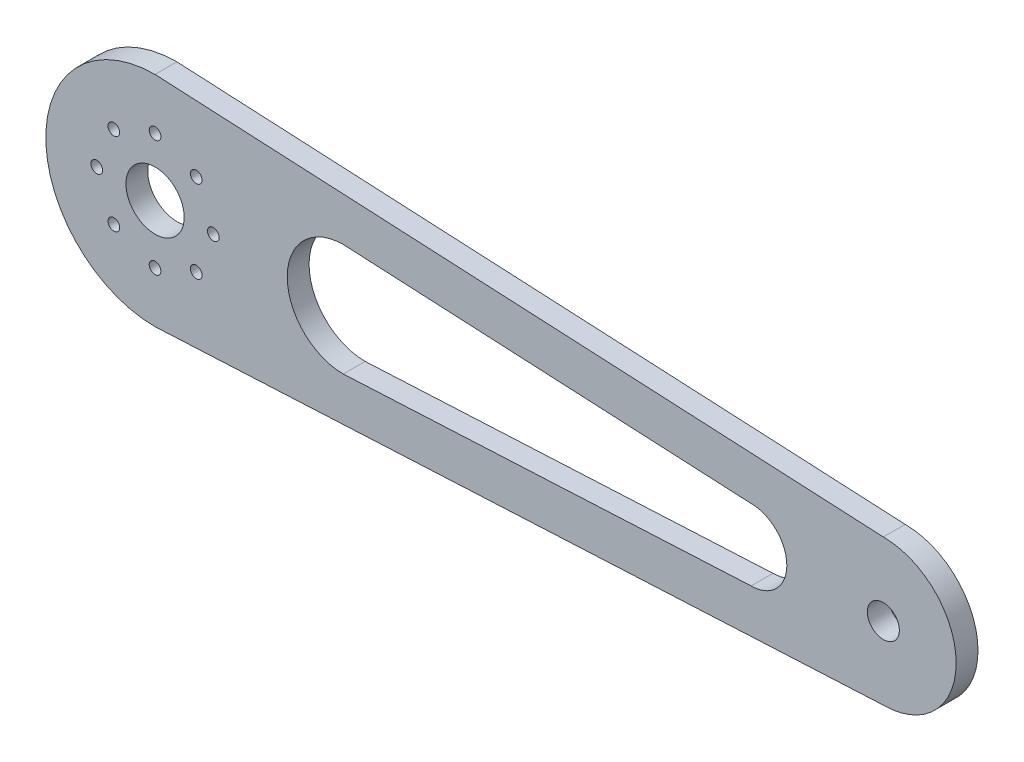
ISO-10303-21;
HEADER;
FILE_DESCRIPTION(('STEP AP214'),'2;1');
FILE_NAME('part.step','',(''),(''),'','','');
FILE_SCHEMA(('AUTOMOTIVE_DESIGN { 1 0 10303 214 1 1 1 1 }'));
ENDSEC;
DATA;
#1=APPLICATION_CONTEXT('core data for automotive mechanical design processes');
#2=APPLICATION_PROTOCOL_DEFINITION('international standard','automotive_design',2000,#1);
#3=PRODUCT_CONTEXT('',#1,'mechanical');
#4=PRODUCT('Part','Part','',(#3));
#5=PRODUCT_RELATED_PRODUCT_CATEGORY('part','',(#4));
#6=PRODUCT_DEFINITION_FORMATION('','',#4);
#7=PRODUCT_DEFINITION_CONTEXT('part definition',#1,'design');
#8=PRODUCT_DEFINITION('design','',#6,#7);
#9=PRODUCT_DEFINITION_SHAPE('','',#8);
#10=(LENGTH_UNIT() NAMED_UNIT(*) SI_UNIT(.MILLI.,.METRE.));
#11=(NAMED_UNIT(*) PLANE_ANGLE_UNIT() SI_UNIT($,.RADIAN.));
#12=(NAMED_UNIT(*) SI_UNIT($,.STERADIAN.) SOLID_ANGLE_UNIT());
#13=UNCERTAINTY_MEASURE_WITH_UNIT(LENGTH_MEASURE(1.E-05),#10,'distance_accuracy_value','');
#14=(GEOMETRIC_REPRESENTATION_CONTEXT(3) GLOBAL_UNCERTAINTY_ASSIGNED_CONTEXT((#13)) GLOBAL_UNIT_ASSIGNED_CONTEXT((#10,
#11,#12)) REPRESENTATION_CONTEXT('',''));
#15=CARTESIAN_POINT('',(0.,0.,0.));
#16=DIRECTION('',(0.,0.,1.));
#17=DIRECTION('',(1.,0.,0.));
#18=AXIS2_PLACEMENT_3D('',#15,#16,#17);
#19=CARTESIAN_POINT('',(0.,0.,-1.5));
#20=DIRECTION('',(0.,0.,1.));
#21=DIRECTION('',(1.,0.,0.));
#22=AXIS2_PLACEMENT_3D('',#19,#20,#21);
#23=CYLINDRICAL_SURFACE('',#22,15.);
#24=DIRECTION('',(0.,0.,1.));
#25=VECTOR('',#24,1.);
#26=CARTESIAN_POINT('',(0.,-15.,-1.5));
#27=LINE('',#26,#25);
#28=CARTESIAN_POINT('',(0.,-15.,-1.5));
#29=VERTEX_POINT('',#28);
#30=CARTESIAN_POINT('',(0.,-15.,1.5));
#31=VERTEX_POINT('',#30);
#32=EDGE_CURVE('E38',#29,#31,#27,.T.);
#33=ORIENTED_EDGE('',*,*,#32,.T.);
#34=CARTESIAN_POINT('',(0.,0.,1.5));
#35=DIRECTION('',(0.,0.,1.));
#36=DIRECTION('',(1.,0.,0.));
#37=AXIS2_PLACEMENT_3D('',#34,#35,#36);
#38=CIRCLE('',#37,15.);
#39=CARTESIAN_POINT('',(0.,15.,1.5));
#40=VERTEX_POINT('',#39);
#41=EDGE_CURVE('E160',#40,#31,#38,.T.);
#42=ORIENTED_EDGE('',*,*,#41,.F.);
#43=DIRECTION('',(0.,0.,1.));
#44=VECTOR('',#43,1.);
#45=CARTESIAN_POINT('',(0.,15.,-1.5));
#46=LINE('',#45,#44);
#47=CARTESIAN_POINT('',(0.,15.,-1.5));
#48=VERTEX_POINT('',#47);
#49=EDGE_CURVE('E11',#48,#40,#46,.T.);
#50=ORIENTED_EDGE('',*,*,#49,.F.);
#51=CARTESIAN_POINT('',(0.,0.,-1.5));
#52=DIRECTION('',(0.,0.,1.));
#53=DIRECTION('',(1.,0.,0.));
#54=AXIS2_PLACEMENT_3D('',#51,#52,#53);
#55=CIRCLE('',#54,15.);
#56=EDGE_CURVE('E212',#48,#29,#55,.T.);
#57=ORIENTED_EDGE('',*,*,#56,.T.);
#58=EDGE_LOOP('',(#33,#42,#50,#57));
#59=FACE_BOUND('',#58,.T.);
#60=ADVANCED_FACE('F35',(#59),#23,.T.);
#61=CARTESIAN_POINT('',(0.,15.,-1.5));
#62=DIRECTION('',(0.0499376169438922,0.998752338877845,0.));
#63=DIRECTION('',(-0.998752338877845,0.0499376169438922,0.));
#64=AXIS2_PLACEMENT_3D('',#61,#62,#63);
#65=PLANE('',#64);
#66=ORIENTED_EDGE('',*,*,#49,.T.);
#67=DIRECTION('',(-0.998752338877845,0.0499376169438922,0.));
#68=VECTOR('',#67,1.);
#69=CARTESIAN_POINT('',(0.,15.,1.5));
#70=LINE('',#69,#68);
#71=CARTESIAN_POINT('',(100.,10.,1.5));
#72=VERTEX_POINT('',#71);
#73=EDGE_CURVE('E169',#72,#40,#70,.T.);
#74=ORIENTED_EDGE('',*,*,#73,.F.);
#75=DIRECTION('',(0.,0.,1.));
#76=VECTOR('',#75,1.);
#77=CARTESIAN_POINT('',(100.,10.,-1.5));
#78=LINE('',#77,#76);
#79=CARTESIAN_POINT('',(100.,10.,-1.5));
#80=VERTEX_POINT('',#79);
#81=EDGE_CURVE('E43',#80,#72,#78,.T.);
#82=ORIENTED_EDGE('',*,*,#81,.F.);
#83=DIRECTION('',(-0.998752338877845,0.0499376169438922,0.));
#84=VECTOR('',#83,1.);
#85=CARTESIAN_POINT('',(0.,15.,-1.5));
#86=LINE('',#85,#84);
#87=EDGE_CURVE('E220',#80,#48,#86,.T.);
#88=ORIENTED_EDGE('',*,*,#87,.T.);
#89=EDGE_LOOP('',(#66,#74,#82,#88));
#90=FACE_BOUND('',#89,.T.);
#91=ADVANCED_FACE('F233',(#90),#65,.T.);
#92=CARTESIAN_POINT('',(100.,0.,-1.5));
#93=DIRECTION('',(0.,0.,1.));
#94=DIRECTION('',(1.,0.,0.));
#95=AXIS2_PLACEMENT_3D('',#92,#93,#94);
#96=CYLINDRICAL_SURFACE('',#95,10.);
#97=ORIENTED_EDGE('',*,*,#81,.T.);
#98=CARTESIAN_POINT('',(100.,0.,1.5));
#99=DIRECTION('',(0.,0.,1.));
#100=DIRECTION('',(1.,0.,0.));
#101=AXIS2_PLACEMENT_3D('',#98,#99,#100);
#102=CIRCLE('',#101,10.);
#103=CARTESIAN_POINT('',(100.,-10.,1.5));
#104=VERTEX_POINT('',#103);
#105=EDGE_CURVE('E166',#104,#72,#102,.T.);
#106=ORIENTED_EDGE('',*,*,#105,.F.);
#107=DIRECTION('',(0.,0.,1.));
#108=VECTOR('',#107,1.);
#109=CARTESIAN_POINT('',(100.,-10.,-1.5));
#110=LINE('',#109,#108);
#111=CARTESIAN_POINT('',(100.,-10.,-1.5));
#112=VERTEX_POINT('',#111);
#113=EDGE_CURVE('E223',#112,#104,#110,.T.);
#114=ORIENTED_EDGE('',*,*,#113,.F.);
#115=CARTESIAN_POINT('',(100.,0.,-1.5));
#116=DIRECTION('',(0.,0.,1.));
#117=DIRECTION('',(1.,0.,0.));
#118=AXIS2_PLACEMENT_3D('',#115,#116,#117);
#119=CIRCLE('',#118,10.);
#120=EDGE_CURVE('E217',#112,#80,#119,.T.);
#121=ORIENTED_EDGE('',*,*,#120,.T.);
#122=EDGE_LOOP('',(#97,#106,#114,#121));
#123=FACE_BOUND('',#122,.T.);
#124=ADVANCED_FACE('F239',(#123),#96,.T.);
#125=CARTESIAN_POINT('',(0.,-15.,-1.5));
#126=DIRECTION('',(0.0499376169438922,-0.998752338877845,0.));
#127=DIRECTION('',(0.998752338877845,0.0499376169438922,0.));
#128=AXIS2_PLACEMENT_3D('',#125,#126,#127);
#129=PLANE('',#128);
#130=ORIENTED_EDGE('',*,*,#113,.T.);
#131=DIRECTION('',(0.998752338877845,0.0499376169438922,0.));
#132=VECTOR('',#131,1.);
#133=CARTESIAN_POINT('',(0.,-15.,1.5));
#134=LINE('',#133,#132);
#135=EDGE_CURVE('E163',#31,#104,#134,.T.);
#136=ORIENTED_EDGE('',*,*,#135,.F.);
#137=ORIENTED_EDGE('',*,*,#32,.F.);
#138=DIRECTION('',(0.998752338877845,0.0499376169438922,0.));
#139=VECTOR('',#138,1.);
#140=CARTESIAN_POINT('',(0.,-15.,-1.5));
#141=LINE('',#140,#139);
#142=EDGE_CURVE('E214',#29,#112,#141,.T.);
#143=ORIENTED_EDGE('',*,*,#142,.T.);
#144=EDGE_LOOP('',(#130,#136,#137,#143));
#145=FACE_BOUND('',#144,.T.);
#146=ADVANCED_FACE('F227',(#145),#129,.T.);
#147=CARTESIAN_POINT('',(0.,0.,-1.5));
#148=DIRECTION('',(0.,0.,1.));
#149=DIRECTION('',(1.,0.,0.));
#150=AXIS2_PLACEMENT_3D('',#147,#148,#149);
#151=PLANE('',#150);
#152=CARTESIAN_POINT('',(100.,0.,-1.5));
#153=DIRECTION('',(0.,0.,1.));
#154=DIRECTION('',(1.,0.,0.));
#155=AXIS2_PLACEMENT_3D('',#152,#153,#154);
#156=CIRCLE('',#155,2.2);
#157=CARTESIAN_POINT('',(102.2,0.,-1.5));
#158=VERTEX_POINT('',#157);
#159=EDGE_CURVE('E172',#158,#158,#156,.T.);
#160=ORIENTED_EDGE('',*,*,#159,.T.);
#161=EDGE_LOOP('',(#160));
#162=FACE_BOUND('',#161,.T.);
#163=DIRECTION('',(-0.998752338877845,0.0499376169438922,0.));
#164=VECTOR('',#163,1.);
#165=CARTESIAN_POINT('',(25.8500936329953,7.7,-1.5));
#166=LINE('',#165,#164);
#167=CARTESIAN_POINT('',(81.8500936329953,4.9,-1.5));
#168=VERTEX_POINT('',#167);
#169=CARTESIAN_POINT('',(25.8500936329953,7.7,-1.5));
#170=VERTEX_POINT('',#169);
#171=EDGE_CURVE('E112',#168,#170,#166,.T.);
#172=ORIENTED_EDGE('',*,*,#171,.T.);
#173=CARTESIAN_POINT('',(25.8500936329953,0.,-1.5));
#174=DIRECTION('',(0.,0.,1.));
#175=DIRECTION('',(1.,0.,0.));
#176=AXIS2_PLACEMENT_3D('',#173,#174,#175);
#177=CIRCLE('',#176,7.7);
#178=CARTESIAN_POINT('',(25.8500936329953,-7.7,-1.5));
#179=VERTEX_POINT('',#178);
#180=EDGE_CURVE('E175',#170,#179,#177,.T.);
#181=ORIENTED_EDGE('',*,*,#180,.T.);
#182=DIRECTION('',(0.998752338877845,0.0499376169438922,0.));
#183=VECTOR('',#182,1.);
#184=CARTESIAN_POINT('',(25.8500936329953,-7.7,-1.5));
#185=LINE('',#184,#183);
#186=CARTESIAN_POINT('',(81.8500936329953,-4.9,-1.5));
#187=VERTEX_POINT('',#186);
#188=EDGE_CURVE('E107',#179,#187,#185,.T.);
#189=ORIENTED_EDGE('',*,*,#188,.T.);
#190=CARTESIAN_POINT('',(81.8500936329953,0.,-1.5));
#191=DIRECTION('',(0.,0.,1.));
#192=DIRECTION('',(1.,0.,0.));
#193=AXIS2_PLACEMENT_3D('',#190,#191,#192);
#194=CIRCLE('',#193,4.9);
#195=EDGE_CURVE('E51',#187,#168,#194,.T.);
#196=ORIENTED_EDGE('',*,*,#195,.T.);
#197=EDGE_LOOP('',(#172,#181,#189,#196));
#198=FACE_BOUND('',#197,.T.);
#199=CARTESIAN_POINT('',(0.,-8.,-1.5));
#200=DIRECTION('',(0.,0.,1.));
#201=DIRECTION('',(1.,0.,0.));
#202=AXIS2_PLACEMENT_3D('',#199,#200,#201);
#203=CIRCLE('',#202,0.8);
#204=CARTESIAN_POINT('',(0.79999999999996,-8.,-1.5));
#205=VERTEX_POINT('',#204);
#206=EDGE_CURVE('E182',#205,#205,#203,.T.);
#207=ORIENTED_EDGE('',*,*,#206,.T.);
#208=EDGE_LOOP('',(#207));
#209=FACE_BOUND('',#208,.T.);
#210=CARTESIAN_POINT('',(5.65685424949228,-5.65685424949248,-1.5));
#211=DIRECTION('',(0.,0.,1.));
#212=DIRECTION('',(1.,0.,0.));
#213=AXIS2_PLACEMENT_3D('',#210,#211,#212);
#214=CIRCLE('',#213,0.800000000000001);
#215=CARTESIAN_POINT('',(6.45685424949229,-5.65685424949248,-1.5));
#216=VERTEX_POINT('',#215);
#217=EDGE_CURVE('E188',#216,#216,#214,.T.);
#218=ORIENTED_EDGE('',*,*,#217,.T.);
#219=EDGE_LOOP('',(#218));
#220=FACE_BOUND('',#219,.T.);
#221=CARTESIAN_POINT('',(8.,-1.24032728532342E-13,-1.5));
#222=DIRECTION('',(0.,0.,1.));
#223=DIRECTION('',(1.,0.,0.));
#224=AXIS2_PLACEMENT_3D('',#221,#222,#223);
#225=CIRCLE('',#224,0.800000000000001);
#226=CARTESIAN_POINT('',(8.8,-1.24032728532342E-13,-1.5));
#227=VERTEX_POINT('',#226);
#228=EDGE_CURVE('E191',#227,#227,#225,.T.);
#229=ORIENTED_EDGE('',*,*,#228,.T.);
#230=EDGE_LOOP('',(#229));
#231=FACE_BOUND('',#230,.T.);
#232=CARTESIAN_POINT('',(0.,8.,-1.5));
#233=DIRECTION('',(0.,0.,1.));
#234=DIRECTION('',(1.,0.,0.));
#235=AXIS2_PLACEMENT_3D('',#232,#233,#234);
#236=CIRCLE('',#235,0.8);
#237=CARTESIAN_POINT('',(0.800000000000096,8.,-1.5));
#238=VERTEX_POINT('',#237);
#239=EDGE_CURVE('E194',#238,#238,#236,.T.);
#240=ORIENTED_EDGE('',*,*,#239,.T.);
#241=EDGE_LOOP('',(#240));
#242=FACE_BOUND('',#241,.T.);
#243=CARTESIAN_POINT('',(-5.65685424949232,5.65685424949244,-1.5));
#244=DIRECTION('',(0.,0.,1.));
#245=DIRECTION('',(1.,0.,0.));
#246=AXIS2_PLACEMENT_3D('',#243,#244,#245);
#247=CIRCLE('',#246,0.800000000000001);
#248=CARTESIAN_POINT('',(-4.85685424949232,5.65685424949244,-1.5));
#249=VERTEX_POINT('',#248);
#250=EDGE_CURVE('E197',#249,#249,#247,.T.);
#251=ORIENTED_EDGE('',*,*,#250,.T.);
#252=EDGE_LOOP('',(#251));
#253=FACE_BOUND('',#252,.T.);
#254=CARTESIAN_POINT('',(-8.,0.,-1.5));
#255=DIRECTION('',(0.,0.,1.));
#256=DIRECTION('',(1.,0.,0.));
#257=AXIS2_PLACEMENT_3D('',#254,#255,#256);
#258=CIRCLE('',#257,0.800000000000001);
#259=CARTESIAN_POINT('',(-7.2,0.,-1.5));
#260=VERTEX_POINT('',#259);
#261=EDGE_CURVE('E200',#260,#260,#258,.T.);
#262=ORIENTED_EDGE('',*,*,#261,.T.);
#263=EDGE_LOOP('',(#262));
#264=FACE_BOUND('',#263,.T.);
#265=CARTESIAN_POINT('',(5.65685424949238,5.65685424949238,-1.5));
#266=DIRECTION('',(0.,0.,1.));
#267=DIRECTION('',(1.,0.,0.));
#268=AXIS2_PLACEMENT_3D('',#265,#266,#267);
#269=CIRCLE('',#268,0.800000000000001);
#270=CARTESIAN_POINT('',(6.45685424949238,5.65685424949238,-1.5));
#271=VERTEX_POINT('',#270);
#272=EDGE_CURVE('E203',#271,#271,#269,.T.);
#273=ORIENTED_EDGE('',*,*,#272,.T.);
#274=EDGE_LOOP('',(#273));
#275=FACE_BOUND('',#274,.T.);
#276=CARTESIAN_POINT('',(-5.65685424949242,-5.65685424949234,-1.5));
#277=DIRECTION('',(0.,0.,1.));
#278=DIRECTION('',(1.,0.,0.));
#279=AXIS2_PLACEMENT_3D('',#276,#277,#278);
#280=CIRCLE('',#279,0.8);
#281=CARTESIAN_POINT('',(-4.85685424949242,-5.65685424949234,-1.5));
#282=VERTEX_POINT('',#281);
#283=EDGE_CURVE('E206',#282,#282,#280,.T.);
#284=ORIENTED_EDGE('',*,*,#283,.T.);
#285=EDGE_LOOP('',(#284));
#286=FACE_BOUND('',#285,.T.);
#287=CARTESIAN_POINT('',(0.,0.,-1.5));
#288=DIRECTION('',(0.,0.,1.));
#289=DIRECTION('',(1.,0.,0.));
#290=AXIS2_PLACEMENT_3D('',#287,#288,#289);
#291=CIRCLE('',#290,4.);
#292=CARTESIAN_POINT('',(4.,0.,-1.5));
#293=VERTEX_POINT('',#292);
#294=EDGE_CURVE('E209',#293,#293,#291,.T.);
#295=ORIENTED_EDGE('',*,*,#294,.T.);
#296=EDGE_LOOP('',(#295));
#297=FACE_BOUND('',#296,.T.);
#298=ORIENTED_EDGE('',*,*,#56,.F.);
#299=ORIENTED_EDGE('',*,*,#87,.F.);
#300=ORIENTED_EDGE('',*,*,#120,.F.);
#301=ORIENTED_EDGE('',*,*,#142,.F.);
#302=EDGE_LOOP('',(#298,#299,#300,#301));
#303=FACE_BOUND('',#302,.T.);
#304=ADVANCED_FACE('F237',(#162,#198,#209,#220,#231,#242,#253,#264,#275,#286,#297,#303),#151,.F.);
#305=CARTESIAN_POINT('',(0.,0.,-1.5));
#306=DIRECTION('',(0.,0.,1.));
#307=DIRECTION('',(1.,0.,0.));
#308=AXIS2_PLACEMENT_3D('',#305,#306,#307);
#309=CYLINDRICAL_SURFACE('',#308,4.);
#310=ORIENTED_EDGE('',*,*,#294,.F.);
#311=EDGE_LOOP('',(#310));
#312=FACE_BOUND('',#311,.T.);
#313=CARTESIAN_POINT('',(0.,0.,1.5));
#314=DIRECTION('',(0.,0.,1.));
#315=DIRECTION('',(1.,0.,0.));
#316=AXIS2_PLACEMENT_3D('',#313,#314,#315);
#317=CIRCLE('',#316,4.);
#318=CARTESIAN_POINT('',(4.,0.,1.5));
#319=VERTEX_POINT('',#318);
#320=EDGE_CURVE('E157',#319,#319,#317,.T.);
#321=ORIENTED_EDGE('',*,*,#320,.T.);
#322=EDGE_LOOP('',(#321));
#323=FACE_BOUND('',#322,.T.);
#324=ADVANCED_FACE('F274',(#312,#323),#309,.F.);
#325=CARTESIAN_POINT('',(-5.65685424949242,-5.65685424949234,-1.5));
#326=DIRECTION('',(0.,0.,1.));
#327=DIRECTION('',(1.,0.,0.));
#328=AXIS2_PLACEMENT_3D('',#325,#326,#327);
#329=CYLINDRICAL_SURFACE('',#328,0.8);
#330=ORIENTED_EDGE('',*,*,#283,.F.);
#331=EDGE_LOOP('',(#330));
#332=FACE_BOUND('',#331,.T.);
#333=CARTESIAN_POINT('',(-5.65685424949242,-5.65685424949234,1.5));
#334=DIRECTION('',(0.,0.,1.));
#335=DIRECTION('',(1.,0.,0.));
#336=AXIS2_PLACEMENT_3D('',#333,#334,#335);
#337=CIRCLE('',#336,0.8);
#338=CARTESIAN_POINT('',(-4.85685424949242,-5.65685424949234,1.5));
#339=VERTEX_POINT('',#338);
#340=EDGE_CURVE('E154',#339,#339,#337,.T.);
#341=ORIENTED_EDGE('',*,*,#340,.T.);
#342=EDGE_LOOP('',(#341));
#343=FACE_BOUND('',#342,.T.);
#344=ADVANCED_FACE('F284',(#332,#343),#329,.F.);
#345=CARTESIAN_POINT('',(5.65685424949238,5.65685424949238,-1.5));
#346=DIRECTION('',(0.,0.,1.));
#347=DIRECTION('',(1.,0.,0.));
#348=AXIS2_PLACEMENT_3D('',#345,#346,#347);
#349=CYLINDRICAL_SURFACE('',#348,0.800000000000001);
#350=ORIENTED_EDGE('',*,*,#272,.F.);
#351=EDGE_LOOP('',(#350));
#352=FACE_BOUND('',#351,.T.);
#353=CARTESIAN_POINT('',(5.65685424949238,5.65685424949238,1.5));
#354=DIRECTION('',(0.,0.,1.));
#355=DIRECTION('',(1.,0.,0.));
#356=AXIS2_PLACEMENT_3D('',#353,#354,#355);
#357=CIRCLE('',#356,0.800000000000001);
#358=CARTESIAN_POINT('',(6.45685424949238,5.65685424949238,1.5));
#359=VERTEX_POINT('',#358);
#360=EDGE_CURVE('E151',#359,#359,#357,.T.);
#361=ORIENTED_EDGE('',*,*,#360,.T.);
#362=EDGE_LOOP('',(#361));
#363=FACE_BOUND('',#362,.T.);
#364=ADVANCED_FACE('F294',(#352,#363),#349,.F.);
#365=CARTESIAN_POINT('',(-8.,0.,-1.5));
#366=DIRECTION('',(0.,0.,1.));
#367=DIRECTION('',(1.,0.,0.));
#368=AXIS2_PLACEMENT_3D('',#365,#366,#367);
#369=CYLINDRICAL_SURFACE('',#368,0.800000000000001);
#370=ORIENTED_EDGE('',*,*,#261,.F.);
#371=EDGE_LOOP('',(#370));
#372=FACE_BOUND('',#371,.T.);
#373=CARTESIAN_POINT('',(-8.,0.,1.5));
#374=DIRECTION('',(0.,0.,1.));
#375=DIRECTION('',(1.,0.,0.));
#376=AXIS2_PLACEMENT_3D('',#373,#374,#375);
#377=CIRCLE('',#376,0.800000000000001);
#378=CARTESIAN_POINT('',(-7.2,0.,1.5));
#379=VERTEX_POINT('',#378);
#380=EDGE_CURVE('E148',#379,#379,#377,.T.);
#381=ORIENTED_EDGE('',*,*,#380,.T.);
#382=EDGE_LOOP('',(#381));
#383=FACE_BOUND('',#382,.T.);
#384=ADVANCED_FACE('F304',(#372,#383),#369,.F.);
#385=CARTESIAN_POINT('',(-5.65685424949232,5.65685424949244,-1.5));
#386=DIRECTION('',(0.,0.,1.));
#387=DIRECTION('',(1.,0.,0.));
#388=AXIS2_PLACEMENT_3D('',#385,#386,#387);
#389=CYLINDRICAL_SURFACE('',#388,0.800000000000001);
#390=ORIENTED_EDGE('',*,*,#250,.F.);
#391=EDGE_LOOP('',(#390));
#392=FACE_BOUND('',#391,.T.);
#393=CARTESIAN_POINT('',(-5.65685424949232,5.65685424949244,1.5));
#394=DIRECTION('',(0.,0.,1.));
#395=DIRECTION('',(1.,0.,0.));
#396=AXIS2_PLACEMENT_3D('',#393,#394,#395);
#397=CIRCLE('',#396,0.800000000000001);
#398=CARTESIAN_POINT('',(-4.85685424949232,5.65685424949244,1.5));
#399=VERTEX_POINT('',#398);
#400=EDGE_CURVE('E145',#399,#399,#397,.T.);
#401=ORIENTED_EDGE('',*,*,#400,.T.);
#402=EDGE_LOOP('',(#401));
#403=FACE_BOUND('',#402,.T.);
#404=ADVANCED_FACE('F314',(#392,#403),#389,.F.);
#405=CARTESIAN_POINT('',(0.,8.,-1.5));
#406=DIRECTION('',(0.,0.,1.));
#407=DIRECTION('',(1.,0.,0.));
#408=AXIS2_PLACEMENT_3D('',#405,#406,#407);
#409=CYLINDRICAL_SURFACE('',#408,0.8);
#410=ORIENTED_EDGE('',*,*,#239,.F.);
#411=EDGE_LOOP('',(#410));
#412=FACE_BOUND('',#411,.T.);
#413=CARTESIAN_POINT('',(0.,8.,1.5));
#414=DIRECTION('',(0.,0.,1.));
#415=DIRECTION('',(1.,0.,0.));
#416=AXIS2_PLACEMENT_3D('',#413,#414,#415);
#417=CIRCLE('',#416,0.8);
#418=CARTESIAN_POINT('',(0.800000000000096,8.,1.5));
#419=VERTEX_POINT('',#418);
#420=EDGE_CURVE('E142',#419,#419,#417,.T.);
#421=ORIENTED_EDGE('',*,*,#420,.T.);
#422=EDGE_LOOP('',(#421));
#423=FACE_BOUND('',#422,.T.);
#424=ADVANCED_FACE('F324',(#412,#423),#409,.F.);
#425=CARTESIAN_POINT('',(8.,-1.24032728532342E-13,-1.5));
#426=DIRECTION('',(0.,0.,1.));
#427=DIRECTION('',(1.,0.,0.));
#428=AXIS2_PLACEMENT_3D('',#425,#426,#427);
#429=CYLINDRICAL_SURFACE('',#428,0.800000000000001);
#430=ORIENTED_EDGE('',*,*,#228,.F.);
#431=EDGE_LOOP('',(#430));
#432=FACE_BOUND('',#431,.T.);
#433=CARTESIAN_POINT('',(8.,-1.24032728532342E-13,1.5));
#434=DIRECTION('',(0.,0.,1.));
#435=DIRECTION('',(1.,0.,0.));
#436=AXIS2_PLACEMENT_3D('',#433,#434,#435);
#437=CIRCLE('',#436,0.800000000000001);
#438=CARTESIAN_POINT('',(8.8,-1.24032728532342E-13,1.5));
#439=VERTEX_POINT('',#438);
#440=EDGE_CURVE('E139',#439,#439,#437,.T.);
#441=ORIENTED_EDGE('',*,*,#440,.T.);
#442=EDGE_LOOP('',(#441));
#443=FACE_BOUND('',#442,.T.);
#444=ADVANCED_FACE('F334',(#432,#443),#429,.F.);
#445=CARTESIAN_POINT('',(5.65685424949228,-5.65685424949248,-1.5));
#446=DIRECTION('',(0.,0.,1.));
#447=DIRECTION('',(1.,0.,0.));
#448=AXIS2_PLACEMENT_3D('',#445,#446,#447);
#449=CYLINDRICAL_SURFACE('',#448,0.800000000000001);
#450=ORIENTED_EDGE('',*,*,#217,.F.);
#451=EDGE_LOOP('',(#450));
#452=FACE_BOUND('',#451,.T.);
#453=CARTESIAN_POINT('',(5.65685424949228,-5.65685424949248,1.5));
#454=DIRECTION('',(0.,0.,1.));
#455=DIRECTION('',(1.,0.,0.));
#456=AXIS2_PLACEMENT_3D('',#453,#454,#455);
#457=CIRCLE('',#456,0.800000000000001);
#458=CARTESIAN_POINT('',(6.45685424949229,-5.65685424949248,1.5));
#459=VERTEX_POINT('',#458);
#460=EDGE_CURVE('E136',#459,#459,#457,.T.);
#461=ORIENTED_EDGE('',*,*,#460,.T.);
#462=EDGE_LOOP('',(#461));
#463=FACE_BOUND('',#462,.T.);
#464=ADVANCED_FACE('F344',(#452,#463),#449,.F.);
#465=CARTESIAN_POINT('',(0.,-8.,-1.5));
#466=DIRECTION('',(0.,0.,1.));
#467=DIRECTION('',(1.,0.,0.));
#468=AXIS2_PLACEMENT_3D('',#465,#466,#467);
#469=CYLINDRICAL_SURFACE('',#468,0.8);
#470=ORIENTED_EDGE('',*,*,#206,.F.);
#471=EDGE_LOOP('',(#470));
#472=FACE_BOUND('',#471,.T.);
#473=CARTESIAN_POINT('',(0.,-8.,1.5));
#474=DIRECTION('',(0.,0.,1.));
#475=DIRECTION('',(1.,0.,0.));
#476=AXIS2_PLACEMENT_3D('',#473,#474,#475);
#477=CIRCLE('',#476,0.8);
#478=CARTESIAN_POINT('',(0.79999999999996,-8.,1.5));
#479=VERTEX_POINT('',#478);
#480=EDGE_CURVE('E133',#479,#479,#477,.T.);
#481=ORIENTED_EDGE('',*,*,#480,.T.);
#482=EDGE_LOOP('',(#481));
#483=FACE_BOUND('',#482,.T.);
#484=ADVANCED_FACE('F354',(#472,#483),#469,.F.);
#485=CARTESIAN_POINT('',(25.8500936329953,0.,-1.5));
#486=DIRECTION('',(0.,0.,1.));
#487=DIRECTION('',(1.,0.,0.));
#488=AXIS2_PLACEMENT_3D('',#485,#486,#487);
#489=CYLINDRICAL_SURFACE('',#488,7.7);
#490=DIRECTION('',(0.,0.,1.));
#491=VECTOR('',#490,1.);
#492=CARTESIAN_POINT('',(25.8500936329953,7.7,-1.5));
#493=LINE('',#492,#491);
#494=CARTESIAN_POINT('',(25.8500936329953,7.7,1.5));
#495=VERTEX_POINT('',#494);
#496=EDGE_CURVE('E117',#170,#495,#493,.T.);
#497=ORIENTED_EDGE('',*,*,#496,.T.);
#498=CARTESIAN_POINT('',(25.8500936329953,0.,1.5));
#499=DIRECTION('',(0.,0.,1.));
#500=DIRECTION('',(1.,0.,0.));
#501=AXIS2_PLACEMENT_3D('',#498,#499,#500);
#502=CIRCLE('',#501,7.7);
#503=CARTESIAN_POINT('',(25.8500936329953,-7.7,1.5));
#504=VERTEX_POINT('',#503);
#505=EDGE_CURVE('E115',#495,#504,#502,.T.);
#506=ORIENTED_EDGE('',*,*,#505,.T.);
#507=DIRECTION('',(0.,0.,1.));
#508=VECTOR('',#507,1.);
#509=CARTESIAN_POINT('',(25.8500936329953,-7.7,-1.5));
#510=LINE('',#509,#508);
#511=EDGE_CURVE('E100',#179,#504,#510,.T.);
#512=ORIENTED_EDGE('',*,*,#511,.F.);
#513=ORIENTED_EDGE('',*,*,#180,.F.);
#514=EDGE_LOOP('',(#497,#506,#512,#513));
#515=FACE_BOUND('',#514,.T.);
#516=ADVANCED_FACE('F116',(#515),#489,.F.);
#517=CARTESIAN_POINT('',(25.8500936329953,7.7,-1.5));
#518=DIRECTION('',(0.0499376169438922,0.998752338877845,0.));
#519=DIRECTION('',(-0.998752338877845,0.0499376169438922,0.));
#520=AXIS2_PLACEMENT_3D('',#517,#518,#519);
#521=PLANE('',#520);
#522=DIRECTION('',(0.,0.,1.));
#523=VECTOR('',#522,1.);
#524=CARTESIAN_POINT('',(81.8500936329953,4.9,-1.5));
#525=LINE('',#524,#523);
#526=CARTESIAN_POINT('',(81.8500936329953,4.9,1.5));
#527=VERTEX_POINT('',#526);
#528=EDGE_CURVE('E183',#168,#527,#525,.T.);
#529=ORIENTED_EDGE('',*,*,#528,.T.);
#530=DIRECTION('',(-0.998752338877845,0.0499376169438922,0.));
#531=VECTOR('',#530,1.);
#532=CARTESIAN_POINT('',(25.8500936329953,7.7,1.5));
#533=LINE('',#532,#531);
#534=EDGE_CURVE('E128',#527,#495,#533,.T.);
#535=ORIENTED_EDGE('',*,*,#534,.T.);
#536=ORIENTED_EDGE('',*,*,#496,.F.);
#537=ORIENTED_EDGE('',*,*,#171,.F.);
#538=EDGE_LOOP('',(#529,#535,#536,#537));
#539=FACE_BOUND('',#538,.T.);
#540=ADVANCED_FACE('F373',(#539),#521,.F.);
#541=CARTESIAN_POINT('',(81.8500936329953,0.,-1.5));
#542=DIRECTION('',(0.,0.,1.));
#543=DIRECTION('',(1.,0.,0.));
#544=AXIS2_PLACEMENT_3D('',#541,#542,#543);
#545=CYLINDRICAL_SURFACE('',#544,4.9);
#546=DIRECTION('',(0.,0.,1.));
#547=VECTOR('',#546,1.);
#548=CARTESIAN_POINT('',(81.8500936329953,-4.9,-1.5));
#549=LINE('',#548,#547);
#550=CARTESIAN_POINT('',(81.8500936329953,-4.9,1.5));
#551=VERTEX_POINT('',#550);
#552=EDGE_CURVE('E111',#187,#551,#549,.T.);
#553=ORIENTED_EDGE('',*,*,#552,.T.);
#554=CARTESIAN_POINT('',(81.8500936329953,0.,1.5));
#555=DIRECTION('',(0.,0.,1.));
#556=DIRECTION('',(1.,0.,0.));
#557=AXIS2_PLACEMENT_3D('',#554,#555,#556);
#558=CIRCLE('',#557,4.9);
#559=EDGE_CURVE('E126',#551,#527,#558,.T.);
#560=ORIENTED_EDGE('',*,*,#559,.T.);
#561=ORIENTED_EDGE('',*,*,#528,.F.);
#562=ORIENTED_EDGE('',*,*,#195,.F.);
#563=EDGE_LOOP('',(#553,#560,#561,#562));
#564=FACE_BOUND('',#563,.T.);
#565=ADVANCED_FACE('F382',(#564),#545,.F.);
#566=CARTESIAN_POINT('',(25.8500936329953,-7.7,-1.5));
#567=DIRECTION('',(0.0499376169438922,-0.998752338877845,0.));
#568=DIRECTION('',(0.998752338877845,0.0499376169438922,0.));
#569=AXIS2_PLACEMENT_3D('',#566,#567,#568);
#570=PLANE('',#569);
#571=ORIENTED_EDGE('',*,*,#511,.T.);
#572=DIRECTION('',(0.998752338877845,0.0499376169438922,0.));
#573=VECTOR('',#572,1.);
#574=CARTESIAN_POINT('',(25.8500936329953,-7.7,1.5));
#575=LINE('',#574,#573);
#576=EDGE_CURVE('E104',#504,#551,#575,.T.);
#577=ORIENTED_EDGE('',*,*,#576,.T.);
#578=ORIENTED_EDGE('',*,*,#552,.F.);
#579=ORIENTED_EDGE('',*,*,#188,.F.);
#580=EDGE_LOOP('',(#571,#577,#578,#579));
#581=FACE_BOUND('',#580,.T.);
#582=ADVANCED_FACE('F102',(#581),#570,.F.);
#583=CARTESIAN_POINT('',(100.,0.,-1.5));
#584=DIRECTION('',(0.,0.,1.));
#585=DIRECTION('',(1.,0.,0.));
#586=AXIS2_PLACEMENT_3D('',#583,#584,#585);
#587=CYLINDRICAL_SURFACE('',#586,2.2);
#588=ORIENTED_EDGE('',*,*,#159,.F.);
#589=EDGE_LOOP('',(#588));
#590=FACE_BOUND('',#589,.T.);
#591=CARTESIAN_POINT('',(100.,0.,1.5));
#592=DIRECTION('',(0.,0.,1.));
#593=DIRECTION('',(1.,0.,0.));
#594=AXIS2_PLACEMENT_3D('',#591,#592,#593);
#595=CIRCLE('',#594,2.2);
#596=CARTESIAN_POINT('',(102.2,0.,1.5));
#597=VERTEX_POINT('',#596);
#598=EDGE_CURVE('E121',#597,#597,#595,.T.);
#599=ORIENTED_EDGE('',*,*,#598,.T.);
#600=EDGE_LOOP('',(#599));
#601=FACE_BOUND('',#600,.T.);
#602=ADVANCED_FACE('F400',(#590,#601),#587,.F.);
#603=CARTESIAN_POINT('',(0.,0.,1.5));
#604=DIRECTION('',(0.,0.,1.));
#605=DIRECTION('',(1.,0.,0.));
#606=AXIS2_PLACEMENT_3D('',#603,#604,#605);
#607=PLANE('',#606);
#608=ORIENTED_EDGE('',*,*,#576,.F.);
#609=ORIENTED_EDGE('',*,*,#505,.F.);
#610=ORIENTED_EDGE('',*,*,#534,.F.);
#611=ORIENTED_EDGE('',*,*,#559,.F.);
#612=EDGE_LOOP('',(#608,#609,#610,#611));
#613=FACE_BOUND('',#612,.T.);
#614=ORIENTED_EDGE('',*,*,#480,.F.);
#615=EDGE_LOOP('',(#614));
#616=FACE_BOUND('',#615,.T.);
#617=ORIENTED_EDGE('',*,*,#440,.F.);
#618=EDGE_LOOP('',(#617));
#619=FACE_BOUND('',#618,.T.);
#620=ORIENTED_EDGE('',*,*,#400,.F.);
#621=EDGE_LOOP('',(#620));
#622=FACE_BOUND('',#621,.T.);
#623=ORIENTED_EDGE('',*,*,#360,.F.);
#624=EDGE_LOOP('',(#623));
#625=FACE_BOUND('',#624,.T.);
#626=ORIENTED_EDGE('',*,*,#320,.F.);
#627=EDGE_LOOP('',(#626));
#628=FACE_BOUND('',#627,.T.);
#629=ORIENTED_EDGE('',*,*,#41,.T.);
#630=ORIENTED_EDGE('',*,*,#135,.T.);
#631=ORIENTED_EDGE('',*,*,#105,.T.);
#632=ORIENTED_EDGE('',*,*,#73,.T.);
#633=EDGE_LOOP('',(#629,#630,#631,#632));
#634=FACE_BOUND('',#633,.T.);
#635=ORIENTED_EDGE('',*,*,#340,.F.);
#636=EDGE_LOOP('',(#635));
#637=FACE_BOUND('',#636,.T.);
#638=ORIENTED_EDGE('',*,*,#380,.F.);
#639=EDGE_LOOP('',(#638));
#640=FACE_BOUND('',#639,.T.);
#641=ORIENTED_EDGE('',*,*,#420,.F.);
#642=EDGE_LOOP('',(#641));
#643=FACE_BOUND('',#642,.T.);
#644=ORIENTED_EDGE('',*,*,#460,.F.);
#645=EDGE_LOOP('',(#644));
#646=FACE_BOUND('',#645,.T.);
#647=ORIENTED_EDGE('',*,*,#598,.F.);
#648=EDGE_LOOP('',(#647));
#649=FACE_BOUND('',#648,.T.);
#650=ADVANCED_FACE('F123',(#613,#616,#619,#622,#625,#628,#634,#637,#640,#643,#646,#649),#607,.T.);
#651=CLOSED_SHELL('',(#60,#91,#124,#146,#304,#324,#344,#364,#384,#404,#424,#444,#464,#484,#516,
#540,#565,#582,#602,#650));
#652=MANIFOLD_SOLID_BREP('B2',#651);
#653=ADVANCED_BREP_SHAPE_REPRESENTATION('',(#18,#652),#14);
#654=SHAPE_DEFINITION_REPRESENTATION(#9,#653);
ENDSEC;
END-ISO-10303-21;
